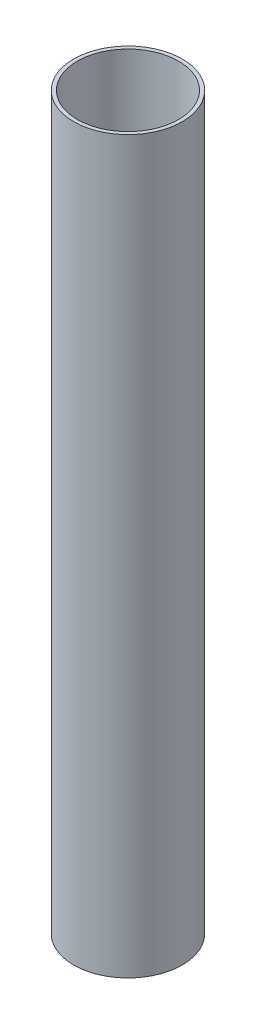
ISO-10303-21;
HEADER;
FILE_DESCRIPTION(('STEP AP214'),'2;1');
FILE_NAME('part.step','',(''),(''),'','','');
FILE_SCHEMA(('AUTOMOTIVE_DESIGN { 1 0 10303 214 1 1 1 1 }'));
ENDSEC;
DATA;
#1=APPLICATION_CONTEXT('core data for automotive mechanical design processes');
#2=APPLICATION_PROTOCOL_DEFINITION('international standard','automotive_design',2000,#1);
#3=PRODUCT_CONTEXT('',#1,'mechanical');
#4=PRODUCT('Part','Part','',(#3));
#5=PRODUCT_RELATED_PRODUCT_CATEGORY('part','',(#4));
#6=PRODUCT_DEFINITION_FORMATION('','',#4);
#7=PRODUCT_DEFINITION_CONTEXT('part definition',#1,'design');
#8=PRODUCT_DEFINITION('design','',#6,#7);
#9=PRODUCT_DEFINITION_SHAPE('','',#8);
#10=(LENGTH_UNIT() NAMED_UNIT(*) SI_UNIT(.MILLI.,.METRE.));
#11=(NAMED_UNIT(*) PLANE_ANGLE_UNIT() SI_UNIT($,.RADIAN.));
#12=(NAMED_UNIT(*) SI_UNIT($,.STERADIAN.) SOLID_ANGLE_UNIT());
#13=UNCERTAINTY_MEASURE_WITH_UNIT(LENGTH_MEASURE(1.E-05),#10,'distance_accuracy_value','');
#14=(GEOMETRIC_REPRESENTATION_CONTEXT(3) GLOBAL_UNCERTAINTY_ASSIGNED_CONTEXT((#13)) GLOBAL_UNIT_ASSIGNED_CONTEXT((#10,
#11,#12)) REPRESENTATION_CONTEXT('',''));
#15=CARTESIAN_POINT('',(0.,0.,0.));
#16=DIRECTION('',(0.,0.,1.));
#17=DIRECTION('',(1.,0.,0.));
#18=AXIS2_PLACEMENT_3D('',#15,#16,#17);
#19=CARTESIAN_POINT('',(0.,279.4,0.));
#20=DIRECTION('',(0.,1.,0.));
#21=DIRECTION('',(0.,0.,1.));
#22=AXIS2_PLACEMENT_3D('',#19,#20,#21);
#23=PLANE('',#22);
#24=CARTESIAN_POINT('',(0.,279.4,0.));
#25=DIRECTION('',(0.,1.,0.));
#26=DIRECTION('',(0.,0.,1.));
#27=AXIS2_PLACEMENT_3D('',#24,#25,#26);
#28=CIRCLE('',#27,20.7645);
#29=CARTESIAN_POINT('',(0.,279.4,20.7645));
#30=VERTEX_POINT('',#29);
#31=EDGE_CURVE('E10',#30,#30,#28,.T.);
#32=ORIENTED_EDGE('',*,*,#31,.T.);
#33=EDGE_LOOP('',(#32));
#34=FACE_BOUND('',#33,.T.);
#35=CARTESIAN_POINT('',(0.,279.4,0.));
#36=DIRECTION('',(0.,1.,0.));
#37=DIRECTION('',(0.,0.,1.));
#38=AXIS2_PLACEMENT_3D('',#35,#36,#37);
#39=CIRCLE('',#38,19.3675);
#40=CARTESIAN_POINT('',(0.,279.4,19.3675));
#41=VERTEX_POINT('',#40);
#42=EDGE_CURVE('E50',#41,#41,#39,.T.);
#43=ORIENTED_EDGE('',*,*,#42,.F.);
#44=EDGE_LOOP('',(#43));
#45=FACE_BOUND('',#44,.T.);
#46=ADVANCED_FACE('F37',(#34,#45),#23,.T.);
#47=CARTESIAN_POINT('',(0.,0.,0.));
#48=DIRECTION('',(0.,1.,0.));
#49=DIRECTION('',(0.,0.,1.));
#50=AXIS2_PLACEMENT_3D('',#47,#48,#49);
#51=PLANE('',#50);
#52=CARTESIAN_POINT('',(0.,0.,0.));
#53=DIRECTION('',(0.,1.,0.));
#54=DIRECTION('',(0.,0.,1.));
#55=AXIS2_PLACEMENT_3D('',#52,#53,#54);
#56=CIRCLE('',#55,20.7645);
#57=CARTESIAN_POINT('',(0.,0.,20.7645));
#58=VERTEX_POINT('',#57);
#59=EDGE_CURVE('E41',#58,#58,#56,.T.);
#60=ORIENTED_EDGE('',*,*,#59,.F.);
#61=EDGE_LOOP('',(#60));
#62=FACE_BOUND('',#61,.T.);
#63=CARTESIAN_POINT('',(0.,0.,0.));
#64=DIRECTION('',(0.,1.,0.));
#65=DIRECTION('',(0.,0.,1.));
#66=AXIS2_PLACEMENT_3D('',#63,#64,#65);
#67=CIRCLE('',#66,19.3675);
#68=CARTESIAN_POINT('',(0.,0.,19.3675));
#69=VERTEX_POINT('',#68);
#70=EDGE_CURVE('E52',#69,#69,#67,.T.);
#71=ORIENTED_EDGE('',*,*,#70,.T.);
#72=EDGE_LOOP('',(#71));
#73=FACE_BOUND('',#72,.T.);
#74=ADVANCED_FACE('F64',(#62,#73),#51,.F.);
#75=CARTESIAN_POINT('',(0.,279.4,0.));
#76=DIRECTION('',(0.,-1.,0.));
#77=DIRECTION('',(0.,0.,-1.));
#78=AXIS2_PLACEMENT_3D('',#75,#76,#77);
#79=CYLINDRICAL_SURFACE('',#78,20.7645);
#80=ORIENTED_EDGE('',*,*,#31,.F.);
#81=EDGE_LOOP('',(#80));
#82=FACE_BOUND('',#81,.T.);
#83=ORIENTED_EDGE('',*,*,#59,.T.);
#84=EDGE_LOOP('',(#83));
#85=FACE_BOUND('',#84,.T.);
#86=ADVANCED_FACE('F39',(#82,#85),#79,.T.);
#87=CARTESIAN_POINT('',(0.,279.4,0.));
#88=DIRECTION('',(0.,-1.,0.));
#89=DIRECTION('',(0.,0.,-1.));
#90=AXIS2_PLACEMENT_3D('',#87,#88,#89);
#91=CYLINDRICAL_SURFACE('',#90,19.3675);
#92=ORIENTED_EDGE('',*,*,#42,.T.);
#93=EDGE_LOOP('',(#92));
#94=FACE_BOUND('',#93,.T.);
#95=ORIENTED_EDGE('',*,*,#70,.F.);
#96=EDGE_LOOP('',(#95));
#97=FACE_BOUND('',#96,.T.);
#98=ADVANCED_FACE('F60',(#94,#97),#91,.F.);
#99=CLOSED_SHELL('',(#46,#74,#86,#98));
#100=MANIFOLD_SOLID_BREP('B2',#99);
#101=ADVANCED_BREP_SHAPE_REPRESENTATION('',(#18,#100),#14);
#102=SHAPE_DEFINITION_REPRESENTATION(#9,#101);
ENDSEC;
END-ISO-10303-21;
